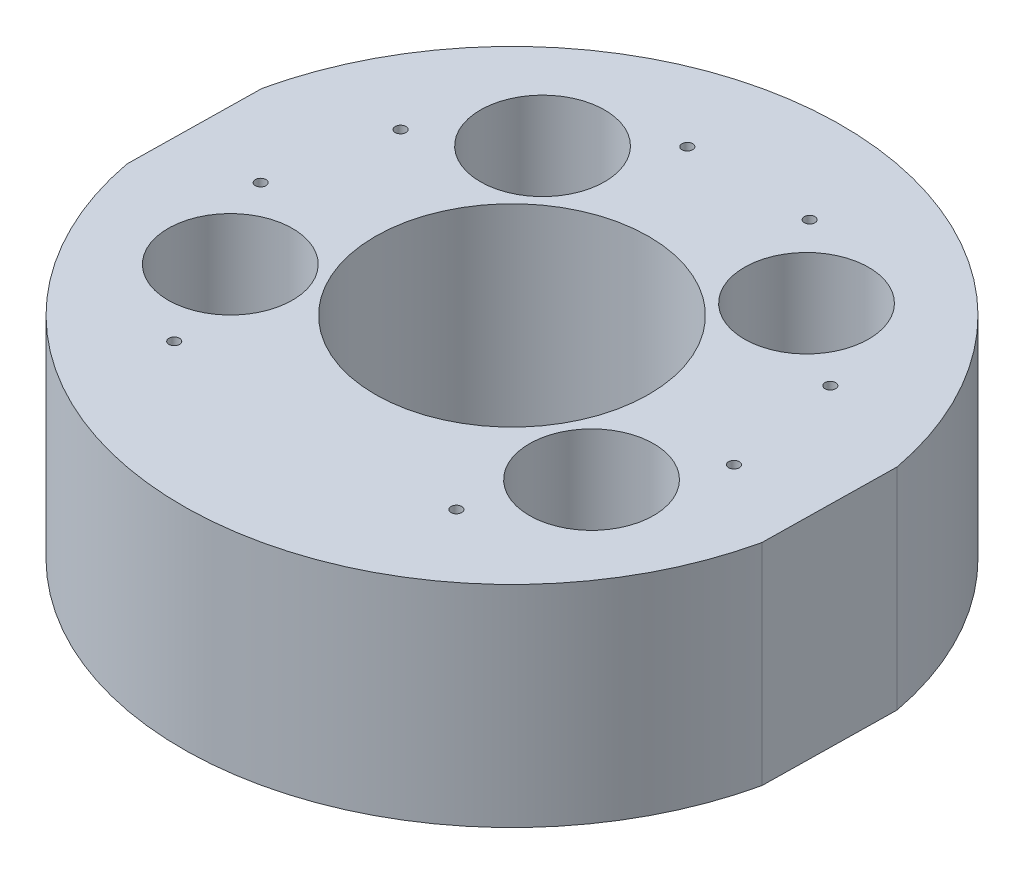
ISO-10303-21;
HEADER;
FILE_DESCRIPTION(('STEP AP214'),'2;1');
FILE_NAME('part.step','',(''),(''),'','','');
FILE_SCHEMA(('AUTOMOTIVE_DESIGN { 1 0 10303 214 1 1 1 1 }'));
ENDSEC;
DATA;
#1=APPLICATION_CONTEXT('core data for automotive mechanical design processes');
#2=APPLICATION_PROTOCOL_DEFINITION('international standard','automotive_design',2000,#1);
#3=PRODUCT_CONTEXT('',#1,'mechanical');
#4=PRODUCT('Part','Part','',(#3));
#5=PRODUCT_RELATED_PRODUCT_CATEGORY('part','',(#4));
#6=PRODUCT_DEFINITION_FORMATION('','',#4);
#7=PRODUCT_DEFINITION_CONTEXT('part definition',#1,'design');
#8=PRODUCT_DEFINITION('design','',#6,#7);
#9=PRODUCT_DEFINITION_SHAPE('','',#8);
#10=(LENGTH_UNIT() NAMED_UNIT(*) SI_UNIT(.MILLI.,.METRE.));
#11=(NAMED_UNIT(*) PLANE_ANGLE_UNIT() SI_UNIT($,.RADIAN.));
#12=(NAMED_UNIT(*) SI_UNIT($,.STERADIAN.) SOLID_ANGLE_UNIT());
#13=UNCERTAINTY_MEASURE_WITH_UNIT(LENGTH_MEASURE(1.E-05),#10,'distance_accuracy_value','');
#14=(GEOMETRIC_REPRESENTATION_CONTEXT(3) GLOBAL_UNCERTAINTY_ASSIGNED_CONTEXT((#13)) GLOBAL_UNIT_ASSIGNED_CONTEXT((#10,
#11,#12)) REPRESENTATION_CONTEXT('',''));
#15=CARTESIAN_POINT('',(0.,0.,0.));
#16=DIRECTION('',(0.,0.,1.));
#17=DIRECTION('',(1.,0.,0.));
#18=AXIS2_PLACEMENT_3D('',#15,#16,#17);
#19=CARTESIAN_POINT('',(-1.02943253800123,39.5,1.15205181792758));
#20=DIRECTION('',(0.,1.,0.));
#21=DIRECTION('',(0.,0.,1.));
#22=AXIS2_PLACEMENT_3D('',#19,#20,#21);
#23=PLANE('',#22);
#24=CARTESIAN_POINT('',(-41.6846327055241,39.5,-18.6012947172572));
#25=DIRECTION('',(0.,1.,0.));
#26=DIRECTION('',(0.,0.,1.));
#27=AXIS2_PLACEMENT_3D('',#24,#25,#26);
#28=CIRCLE('',#27,1.00000000006479);
#29=CARTESIAN_POINT('',(-41.6846327055241,39.5,-17.6012947171924));
#30=VERTEX_POINT('',#29);
#31=EDGE_CURVE('E40',#30,#30,#28,.T.);
#32=ORIENTED_EDGE('',*,*,#31,.F.);
#33=EDGE_LOOP('',(#32));
#34=FACE_BOUND('',#33,.T.);
#35=CARTESIAN_POINT('',(-46.1855870726867,39.5,3.1424557064884));
#36=DIRECTION('',(0.,1.,0.));
#37=DIRECTION('',(0.,0.,1.));
#38=AXIS2_PLACEMENT_3D('',#35,#36,#37);
#39=CIRCLE('',#38,1.00000000000402);
#40=CARTESIAN_POINT('',(-46.1855870726867,39.5,4.14245570649242));
#41=VERTEX_POINT('',#40);
#42=EDGE_CURVE('E136',#41,#41,#39,.T.);
#43=ORIENTED_EDGE('',*,*,#42,.F.);
#44=EDGE_LOOP('',(#43));
#45=FACE_BOUND('',#44,.T.);
#46=CARTESIAN_POINT('',(-28.5029622654473,39.5,37.0441841635424));
#47=DIRECTION('',(0.,1.,0.));
#48=DIRECTION('',(0.,0.,1.));
#49=AXIS2_PLACEMENT_3D('',#46,#47,#48);
#50=CIRCLE('',#49,0.999999999978946);
#51=CARTESIAN_POINT('',(-28.5029622654473,39.5,38.0441841635214));
#52=VERTEX_POINT('',#51);
#53=EDGE_CURVE('E133',#52,#52,#50,.T.);
#54=ORIENTED_EDGE('',*,*,#53,.F.);
#55=EDGE_LOOP('',(#54));
#56=FACE_BOUND('',#55,.T.);
#57=CARTESIAN_POINT('',(25.285237233518,39.5,37.9022648080023));
#58=DIRECTION('',(0.,1.,0.));
#59=DIRECTION('',(0.,0.,1.));
#60=AXIS2_PLACEMENT_3D('',#57,#58,#59);
#61=CIRCLE('',#60,1.00000000003391);
#62=CARTESIAN_POINT('',(25.285237233518,39.5,38.9022648080362));
#63=VERTEX_POINT('',#62);
#64=EDGE_CURVE('E129',#63,#63,#61,.T.);
#65=ORIENTED_EDGE('',*,*,#64,.F.);
#66=EDGE_LOOP('',(#65));
#67=FACE_BOUND('',#66,.T.);
#68=CARTESIAN_POINT('',(44.0402541743087,39.5,4.58182435472986));
#69=DIRECTION('',(0.,1.,0.));
#70=DIRECTION('',(0.,0.,1.));
#71=AXIS2_PLACEMENT_3D('',#68,#69,#70);
#72=CIRCLE('',#71,1.00000000003392);
#73=CARTESIAN_POINT('',(44.0402541743087,39.5,5.58182435476378));
#74=VERTEX_POINT('',#73);
#75=EDGE_CURVE('E125',#74,#74,#72,.T.);
#76=ORIENTED_EDGE('',*,*,#75,.F.);
#77=EDGE_LOOP('',(#76));
#78=FACE_BOUND('',#77,.T.);
#79=CARTESIAN_POINT('',(40.2351677453058,39.5,-17.2944319515756));
#80=DIRECTION('',(0.,1.,0.));
#81=DIRECTION('',(0.,0.,1.));
#82=AXIS2_PLACEMENT_3D('',#79,#80,#81);
#83=CIRCLE('',#82,1.00000000000777);
#84=CARTESIAN_POINT('',(40.2351677453058,39.5,-16.2944319515678));
#85=VERTEX_POINT('',#84);
#86=EDGE_CURVE('E121',#85,#85,#83,.T.);
#87=ORIENTED_EDGE('',*,*,#86,.F.);
#88=EDGE_LOOP('',(#87));
#89=FACE_BOUND('',#88,.T.);
#90=CARTESIAN_POINT('',(11.3307376943618,39.5,-42.3251398097147));
#91=DIRECTION('',(0.,1.,0.));
#92=DIRECTION('',(0.,0.,1.));
#93=AXIS2_PLACEMENT_3D('',#90,#91,#92);
#94=CIRCLE('',#93,1.00000000003986);
#95=CARTESIAN_POINT('',(11.3307376943618,39.5,-41.3251398096748));
#96=VERTEX_POINT('',#95);
#97=EDGE_CURVE('E117',#96,#96,#94,.T.);
#98=ORIENTED_EDGE('',*,*,#97,.F.);
#99=EDGE_LOOP('',(#98));
#100=FACE_BOUND('',#99,.T.);
#101=CARTESIAN_POINT('',(-11.9964868371831,39.5,-42.6972779374856));
#102=DIRECTION('',(0.,1.,0.));
#103=DIRECTION('',(0.,0.,1.));
#104=AXIS2_PLACEMENT_3D('',#101,#102,#103);
#105=CIRCLE('',#104,1.00000000010046);
#106=CARTESIAN_POINT('',(-11.9964868371831,39.5,-41.6972779373851));
#107=VERTEX_POINT('',#106);
#108=EDGE_CURVE('E112',#107,#107,#105,.T.);
#109=ORIENTED_EDGE('',*,*,#108,.F.);
#110=EDGE_LOOP('',(#109));
#111=FACE_BOUND('',#110,.T.);
#112=CARTESIAN_POINT('',(33.1065521303134,39.5,20.3661126777402));
#113=DIRECTION('',(0.,1.,0.));
#114=DIRECTION('',(0.,0.,1.));
#115=AXIS2_PLACEMENT_3D('',#112,#113,#114);
#116=CIRCLE('',#115,11.666);
#117=CARTESIAN_POINT('',(33.1065521303134,39.5,32.0321126777402));
#118=VERTEX_POINT('',#117);
#119=EDGE_CURVE('E167',#118,#118,#116,.T.);
#120=ORIENTED_EDGE('',*,*,#119,.F.);
#121=EDGE_LOOP('',(#120));
#122=FACE_BOUND('',#121,.T.);
#123=CARTESIAN_POINT('',(-25.7151840641316,39.5,-29.2627349738644));
#124=DIRECTION('',(0.,1.,0.));
#125=DIRECTION('',(0.,0.,1.));
#126=AXIS2_PLACEMENT_3D('',#123,#124,#125);
#127=CIRCLE('',#126,11.666);
#128=CARTESIAN_POINT('',(-25.7151840641316,39.5,-17.5967349738644));
#129=VERTEX_POINT('',#128);
#130=EDGE_CURVE('E179',#129,#129,#127,.T.);
#131=ORIENTED_EDGE('',*,*,#130,.F.);
#132=EDGE_LOOP('',(#131));
#133=FACE_BOUND('',#132,.T.);
#134=CARTESIAN_POINT('',(-1.02943253800123,39.5,1.15205181792758));
#135=DIRECTION('',(0.,1.,0.));
#136=DIRECTION('',(0.,0.,1.));
#137=AXIS2_PLACEMENT_3D('',#134,#135,#136);
#138=CIRCLE('',#137,61.8170061942189);
#139=CARTESIAN_POINT('',(59.7022572722056,39.5,-10.3806888629692));
#140=VERTEX_POINT('',#139);
#141=CARTESIAN_POINT('',(-61.3623492511472,39.5,-12.3120268991914));
#142=VERTEX_POINT('',#141);
#143=EDGE_CURVE('E90',#140,#142,#138,.T.);
#144=ORIENTED_EDGE('',*,*,#143,.T.);
#145=DIRECTION('',(-0.0159509238824959,0.,0.999872775920664));
#146=VECTOR('',#145,1.);
#147=CARTESIAN_POINT('',(-61.3623492511472,39.5,-12.3120268991914));
#148=LINE('',#147,#146);
#149=CARTESIAN_POINT('',(-61.7611223482096,39.5,12.6847924988252));
#150=VERTEX_POINT('',#149);
#151=EDGE_CURVE('E85',#142,#150,#148,.T.);
#152=ORIENTED_EDGE('',*,*,#151,.T.);
#153=CARTESIAN_POINT('',(-1.02943253800123,39.5,1.15205181792758));
#154=DIRECTION('',(0.,1.,0.));
#155=DIRECTION('',(0.,0.,1.));
#156=AXIS2_PLACEMENT_3D('',#153,#154,#155);
#157=CIRCLE('',#156,61.817006194219);
#158=CARTESIAN_POINT('',(59.303484175144,39.5,14.6161305350469));
#159=VERTEX_POINT('',#158);
#160=EDGE_CURVE('E88',#150,#159,#157,.T.);
#161=ORIENTED_EDGE('',*,*,#160,.T.);
#162=DIRECTION('',(0.0159509238824956,0.,-0.999872775920664));
#163=VECTOR('',#162,1.);
#164=CARTESIAN_POINT('',(59.7022572722056,39.5,-10.3806888629692));
#165=LINE('',#164,#163);
#166=EDGE_CURVE('E55',#159,#140,#165,.T.);
#167=ORIENTED_EDGE('',*,*,#166,.T.);
#168=EDGE_LOOP('',(#144,#152,#161,#167));
#169=FACE_BOUND('',#168,.T.);
#170=CARTESIAN_POINT('',(-1.02943253800123,39.5,1.15205181792758));
#171=DIRECTION('',(0.,1.,0.));
#172=DIRECTION('',(0.,0.,1.));
#173=AXIS2_PLACEMENT_3D('',#170,#171,#172);
#174=CIRCLE('',#173,25.6670000000009);
#175=CARTESIAN_POINT('',(-1.02943253800123,39.5,26.8190518179285));
#176=VERTEX_POINT('',#175);
#177=EDGE_CURVE('E106',#176,#176,#174,.T.);
#178=ORIENTED_EDGE('',*,*,#177,.F.);
#179=EDGE_LOOP('',(#178));
#180=FACE_BOUND('',#179,.T.);
#181=CARTESIAN_POINT('',(24.6139217532643,39.5,-28.4598370899525));
#182=DIRECTION('',(0.,1.,0.));
#183=DIRECTION('',(0.,0.,1.));
#184=AXIS2_PLACEMENT_3D('',#181,#182,#183);
#185=CIRCLE('',#184,11.666);
#186=CARTESIAN_POINT('',(24.6139217532643,39.5,-16.7938370899525));
#187=VERTEX_POINT('',#186);
#188=EDGE_CURVE('E173',#187,#187,#185,.T.);
#189=ORIENTED_EDGE('',*,*,#188,.F.);
#190=EDGE_LOOP('',(#189));
#191=FACE_BOUND('',#190,.T.);
#192=CARTESIAN_POINT('',(-35.7609326951884,39.5,19.2674728958744));
#193=DIRECTION('',(0.,1.,0.));
#194=DIRECTION('',(0.,0.,1.));
#195=AXIS2_PLACEMENT_3D('',#192,#193,#194);
#196=CIRCLE('',#195,11.666);
#197=CARTESIAN_POINT('',(-35.7609326951884,39.5,30.9334728958744));
#198=VERTEX_POINT('',#197);
#199=EDGE_CURVE('E161',#198,#198,#196,.T.);
#200=ORIENTED_EDGE('',*,*,#199,.F.);
#201=EDGE_LOOP('',(#200));
#202=FACE_BOUND('',#201,.T.);
#203=ADVANCED_FACE('F36',(#34,#45,#56,#67,#78,#89,#100,#111,#122,#133,#169,#180,#191,#202),#23,.T.);
#204=CARTESIAN_POINT('',(-1.02943253800123,0.,1.15205181792758));
#205=DIRECTION('',(0.,1.,0.));
#206=DIRECTION('',(0.,0.,1.));
#207=AXIS2_PLACEMENT_3D('',#204,#205,#206);
#208=PLANE('',#207);
#209=CARTESIAN_POINT('',(33.1065521303134,0.,20.3661126777402));
#210=DIRECTION('',(0.,1.,0.));
#211=DIRECTION('',(0.,0.,1.));
#212=AXIS2_PLACEMENT_3D('',#209,#210,#211);
#213=CIRCLE('',#212,11.666);
#214=CARTESIAN_POINT('',(33.1065521303134,0.,32.0321126777402));
#215=VERTEX_POINT('',#214);
#216=EDGE_CURVE('E164',#215,#215,#213,.T.);
#217=ORIENTED_EDGE('',*,*,#216,.T.);
#218=EDGE_LOOP('',(#217));
#219=FACE_BOUND('',#218,.T.);
#220=CARTESIAN_POINT('',(-25.7151840641316,0.,-29.2627349738644));
#221=DIRECTION('',(0.,1.,0.));
#222=DIRECTION('',(0.,0.,1.));
#223=AXIS2_PLACEMENT_3D('',#220,#221,#222);
#224=CIRCLE('',#223,11.666);
#225=CARTESIAN_POINT('',(-25.7151840641316,0.,-17.5967349738644));
#226=VERTEX_POINT('',#225);
#227=EDGE_CURVE('E176',#226,#226,#224,.T.);
#228=ORIENTED_EDGE('',*,*,#227,.T.);
#229=EDGE_LOOP('',(#228));
#230=FACE_BOUND('',#229,.T.);
#231=CARTESIAN_POINT('',(-1.02943253800123,0.,1.15205181792758));
#232=DIRECTION('',(0.,1.,0.));
#233=DIRECTION('',(0.,0.,1.));
#234=AXIS2_PLACEMENT_3D('',#231,#232,#233);
#235=CIRCLE('',#234,61.8170061942189);
#236=CARTESIAN_POINT('',(59.7022572722056,0.,-10.3806888629692));
#237=VERTEX_POINT('',#236);
#238=CARTESIAN_POINT('',(-61.3623492511472,0.,-12.3120268991914));
#239=VERTEX_POINT('',#238);
#240=EDGE_CURVE('E103',#237,#239,#235,.T.);
#241=ORIENTED_EDGE('',*,*,#240,.F.);
#242=DIRECTION('',(0.0159509238824956,0.,-0.999872775920664));
#243=VECTOR('',#242,1.);
#244=CARTESIAN_POINT('',(59.7022572722056,0.,-10.3806888629692));
#245=LINE('',#244,#243);
#246=CARTESIAN_POINT('',(59.303484175144,0.,14.6161305350469));
#247=VERTEX_POINT('',#246);
#248=EDGE_CURVE('E78',#247,#237,#245,.T.);
#249=ORIENTED_EDGE('',*,*,#248,.F.);
#250=CARTESIAN_POINT('',(-1.02943253800123,0.,1.15205181792758));
#251=DIRECTION('',(0.,1.,0.));
#252=DIRECTION('',(0.,0.,1.));
#253=AXIS2_PLACEMENT_3D('',#250,#251,#252);
#254=CIRCLE('',#253,61.817006194219);
#255=CARTESIAN_POINT('',(-61.7611223482096,0.,12.6847924988252));
#256=VERTEX_POINT('',#255);
#257=EDGE_CURVE('E72',#256,#247,#254,.T.);
#258=ORIENTED_EDGE('',*,*,#257,.F.);
#259=DIRECTION('',(-0.0159509238824959,0.,0.999872775920664));
#260=VECTOR('',#259,1.);
#261=CARTESIAN_POINT('',(-61.3623492511472,0.,-12.3120268991914));
#262=LINE('',#261,#260);
#263=EDGE_CURVE('E94',#239,#256,#262,.T.);
#264=ORIENTED_EDGE('',*,*,#263,.F.);
#265=EDGE_LOOP('',(#241,#249,#258,#264));
#266=FACE_BOUND('',#265,.T.);
#267=CARTESIAN_POINT('',(-1.02943253800123,0.,1.15205181792758));
#268=DIRECTION('',(0.,1.,0.));
#269=DIRECTION('',(0.,0.,1.));
#270=AXIS2_PLACEMENT_3D('',#267,#268,#269);
#271=CIRCLE('',#270,25.6670000000009);
#272=CARTESIAN_POINT('',(-1.02943253800123,0.,26.8190518179285));
#273=VERTEX_POINT('',#272);
#274=EDGE_CURVE('E182',#273,#273,#271,.T.);
#275=ORIENTED_EDGE('',*,*,#274,.T.);
#276=EDGE_LOOP('',(#275));
#277=FACE_BOUND('',#276,.T.);
#278=CARTESIAN_POINT('',(24.6139217532643,0.,-28.4598370899525));
#279=DIRECTION('',(0.,1.,0.));
#280=DIRECTION('',(0.,0.,1.));
#281=AXIS2_PLACEMENT_3D('',#278,#279,#280);
#282=CIRCLE('',#281,11.666);
#283=CARTESIAN_POINT('',(24.6139217532643,0.,-16.7938370899525));
#284=VERTEX_POINT('',#283);
#285=EDGE_CURVE('E170',#284,#284,#282,.T.);
#286=ORIENTED_EDGE('',*,*,#285,.T.);
#287=EDGE_LOOP('',(#286));
#288=FACE_BOUND('',#287,.T.);
#289=CARTESIAN_POINT('',(-35.7609326951884,0.,19.2674728958744));
#290=DIRECTION('',(0.,1.,0.));
#291=DIRECTION('',(0.,0.,1.));
#292=AXIS2_PLACEMENT_3D('',#289,#290,#291);
#293=CIRCLE('',#292,11.666);
#294=CARTESIAN_POINT('',(-35.7609326951884,0.,30.9334728958744));
#295=VERTEX_POINT('',#294);
#296=EDGE_CURVE('E115',#295,#295,#293,.T.);
#297=ORIENTED_EDGE('',*,*,#296,.T.);
#298=EDGE_LOOP('',(#297));
#299=FACE_BOUND('',#298,.T.);
#300=ADVANCED_FACE('F190',(#219,#230,#266,#277,#288,#299),#208,.F.);
#301=CARTESIAN_POINT('',(-1.02943253800123,39.5,1.15205181792758));
#302=DIRECTION('',(0.,-1.,0.));
#303=DIRECTION('',(0.,0.,-1.));
#304=AXIS2_PLACEMENT_3D('',#301,#302,#303);
#305=CYLINDRICAL_SURFACE('',#304,61.8170061942189);
#306=ORIENTED_EDGE('',*,*,#240,.T.);
#307=DIRECTION('',(0.,-1.,0.));
#308=VECTOR('',#307,1.);
#309=CARTESIAN_POINT('',(-61.3623492511472,39.5,-12.3120268991914));
#310=LINE('',#309,#308);
#311=EDGE_CURVE('E11',#142,#239,#310,.T.);
#312=ORIENTED_EDGE('',*,*,#311,.F.);
#313=ORIENTED_EDGE('',*,*,#143,.F.);
#314=DIRECTION('',(0.,-1.,0.));
#315=VECTOR('',#314,1.);
#316=CARTESIAN_POINT('',(59.7022572722056,39.5,-10.3806888629692));
#317=LINE('',#316,#315);
#318=EDGE_CURVE('E99',#140,#237,#317,.T.);
#319=ORIENTED_EDGE('',*,*,#318,.T.);
#320=EDGE_LOOP('',(#306,#312,#313,#319));
#321=FACE_BOUND('',#320,.T.);
#322=ADVANCED_FACE('F38',(#321),#305,.T.);
#323=CARTESIAN_POINT('',(-61.3623492511472,39.5,-12.3120268991914));
#324=DIRECTION('',(0.999872775920664,0.,0.0159509238824959));
#325=DIRECTION('',(0.0159509238824959,0.,-0.999872775920664));
#326=AXIS2_PLACEMENT_3D('',#323,#324,#325);
#327=PLANE('',#326);
#328=ORIENTED_EDGE('',*,*,#263,.T.);
#329=DIRECTION('',(0.,-1.,0.));
#330=VECTOR('',#329,1.);
#331=CARTESIAN_POINT('',(-61.7611223482096,39.5,12.6847924988252));
#332=LINE('',#331,#330);
#333=EDGE_CURVE('E46',#150,#256,#332,.T.);
#334=ORIENTED_EDGE('',*,*,#333,.F.);
#335=ORIENTED_EDGE('',*,*,#151,.F.);
#336=ORIENTED_EDGE('',*,*,#311,.T.);
#337=EDGE_LOOP('',(#328,#334,#335,#336));
#338=FACE_BOUND('',#337,.T.);
#339=ADVANCED_FACE('F93',(#338),#327,.F.);
#340=CARTESIAN_POINT('',(-1.02943253800123,39.5,1.15205181792758));
#341=DIRECTION('',(0.,-1.,0.));
#342=DIRECTION('',(0.,0.,-1.));
#343=AXIS2_PLACEMENT_3D('',#340,#341,#342);
#344=CYLINDRICAL_SURFACE('',#343,61.817006194219);
#345=ORIENTED_EDGE('',*,*,#257,.T.);
#346=DIRECTION('',(0.,-1.,0.));
#347=VECTOR('',#346,1.);
#348=CARTESIAN_POINT('',(59.303484175144,39.5,14.6161305350469));
#349=LINE('',#348,#347);
#350=EDGE_CURVE('E95',#159,#247,#349,.T.);
#351=ORIENTED_EDGE('',*,*,#350,.F.);
#352=ORIENTED_EDGE('',*,*,#160,.F.);
#353=ORIENTED_EDGE('',*,*,#333,.T.);
#354=EDGE_LOOP('',(#345,#351,#352,#353));
#355=FACE_BOUND('',#354,.T.);
#356=ADVANCED_FACE('F97',(#355),#344,.T.);
#357=CARTESIAN_POINT('',(59.7022572722056,39.5,-10.3806888629692));
#358=DIRECTION('',(-0.999872775920664,0.,-0.0159509238824956));
#359=DIRECTION('',(-0.0159509238824956,0.,0.999872775920664));
#360=AXIS2_PLACEMENT_3D('',#357,#358,#359);
#361=PLANE('',#360);
#362=ORIENTED_EDGE('',*,*,#248,.T.);
#363=ORIENTED_EDGE('',*,*,#318,.F.);
#364=ORIENTED_EDGE('',*,*,#166,.F.);
#365=ORIENTED_EDGE('',*,*,#350,.T.);
#366=EDGE_LOOP('',(#362,#363,#364,#365));
#367=FACE_BOUND('',#366,.T.);
#368=ADVANCED_FACE('F196',(#367),#361,.F.);
#369=CARTESIAN_POINT('',(-1.02943253800123,39.5,1.15205181792758));
#370=DIRECTION('',(0.,-1.,0.));
#371=DIRECTION('',(0.,0.,-1.));
#372=AXIS2_PLACEMENT_3D('',#369,#370,#371);
#373=CYLINDRICAL_SURFACE('',#372,25.6670000000009);
#374=ORIENTED_EDGE('',*,*,#177,.T.);
#375=EDGE_LOOP('',(#374));
#376=FACE_BOUND('',#375,.T.);
#377=ORIENTED_EDGE('',*,*,#274,.F.);
#378=EDGE_LOOP('',(#377));
#379=FACE_BOUND('',#378,.T.);
#380=ADVANCED_FACE('F193',(#376,#379),#373,.F.);
#381=CARTESIAN_POINT('',(-25.7151840641316,39.5,-29.2627349738644));
#382=DIRECTION('',(0.,-1.,0.));
#383=DIRECTION('',(0.,0.,-1.));
#384=AXIS2_PLACEMENT_3D('',#381,#382,#383);
#385=CYLINDRICAL_SURFACE('',#384,11.666);
#386=ORIENTED_EDGE('',*,*,#130,.T.);
#387=EDGE_LOOP('',(#386));
#388=FACE_BOUND('',#387,.T.);
#389=ORIENTED_EDGE('',*,*,#227,.F.);
#390=EDGE_LOOP('',(#389));
#391=FACE_BOUND('',#390,.T.);
#392=ADVANCED_FACE('F195',(#388,#391),#385,.F.);
#393=CARTESIAN_POINT('',(24.6139217532643,39.5,-28.4598370899525));
#394=DIRECTION('',(0.,-1.,0.));
#395=DIRECTION('',(0.,0.,-1.));
#396=AXIS2_PLACEMENT_3D('',#393,#394,#395);
#397=CYLINDRICAL_SURFACE('',#396,11.666);
#398=ORIENTED_EDGE('',*,*,#188,.T.);
#399=EDGE_LOOP('',(#398));
#400=FACE_BOUND('',#399,.T.);
#401=ORIENTED_EDGE('',*,*,#285,.F.);
#402=EDGE_LOOP('',(#401));
#403=FACE_BOUND('',#402,.T.);
#404=ADVANCED_FACE('F203',(#400,#403),#397,.F.);
#405=CARTESIAN_POINT('',(33.1065521303134,39.5,20.3661126777402));
#406=DIRECTION('',(0.,-1.,0.));
#407=DIRECTION('',(0.,0.,-1.));
#408=AXIS2_PLACEMENT_3D('',#405,#406,#407);
#409=CYLINDRICAL_SURFACE('',#408,11.666);
#410=ORIENTED_EDGE('',*,*,#119,.T.);
#411=EDGE_LOOP('',(#410));
#412=FACE_BOUND('',#411,.T.);
#413=ORIENTED_EDGE('',*,*,#216,.F.);
#414=EDGE_LOOP('',(#413));
#415=FACE_BOUND('',#414,.T.);
#416=ADVANCED_FACE('F270',(#412,#415),#409,.F.);
#417=CARTESIAN_POINT('',(-35.7609326951884,39.5,19.2674728958744));
#418=DIRECTION('',(0.,-1.,0.));
#419=DIRECTION('',(0.,0.,-1.));
#420=AXIS2_PLACEMENT_3D('',#417,#418,#419);
#421=CYLINDRICAL_SURFACE('',#420,11.666);
#422=ORIENTED_EDGE('',*,*,#199,.T.);
#423=EDGE_LOOP('',(#422));
#424=FACE_BOUND('',#423,.T.);
#425=ORIENTED_EDGE('',*,*,#296,.F.);
#426=EDGE_LOOP('',(#425));
#427=FACE_BOUND('',#426,.T.);
#428=ADVANCED_FACE('F279',(#424,#427),#421,.F.);
#429=CARTESIAN_POINT('',(-11.9964868371831,28.5,-42.6972779374856));
#430=DIRECTION('',(0.,1.,0.));
#431=DIRECTION('',(-1.,0.,0.));
#432=AXIS2_PLACEMENT_3D('',#429,#430,#431);
#433=CYLINDRICAL_SURFACE('',#432,1.00000000010046);
#434=ORIENTED_EDGE('',*,*,#108,.T.);
#435=EDGE_LOOP('',(#434));
#436=FACE_BOUND('',#435,.T.);
#437=CARTESIAN_POINT('',(-11.9964868371831,28.5,-42.6972779374856));
#438=DIRECTION('',(0.,1.,0.));
#439=DIRECTION('',(-1.,0.,0.));
#440=AXIS2_PLACEMENT_3D('',#437,#438,#439);
#441=CIRCLE('',#440,1.00000000010046);
#442=CARTESIAN_POINT('',(-12.9964868372835,28.5,-42.6972779374856));
#443=VERTEX_POINT('',#442);
#444=EDGE_CURVE('E116',#443,#443,#441,.T.);
#445=ORIENTED_EDGE('',*,*,#444,.F.);
#446=EDGE_LOOP('',(#445));
#447=FACE_BOUND('',#446,.T.);
#448=ADVANCED_FACE('F288',(#436,#447),#433,.F.);
#449=CARTESIAN_POINT('',(-11.9964868371831,28.5,-42.6972779374856));
#450=DIRECTION('',(0.,1.,0.));
#451=DIRECTION('',(-1.,0.,0.));
#452=AXIS2_PLACEMENT_3D('',#449,#450,#451);
#453=PLANE('',#452);
#454=ORIENTED_EDGE('',*,*,#444,.T.);
#455=EDGE_LOOP('',(#454));
#456=FACE_BOUND('',#455,.T.);
#457=ADVANCED_FACE('F297',(#456),#453,.T.);
#458=CARTESIAN_POINT('',(11.3307376943618,28.5,-42.3251398097147));
#459=DIRECTION('',(0.,1.,0.));
#460=DIRECTION('',(-1.,0.,0.));
#461=AXIS2_PLACEMENT_3D('',#458,#459,#460);
#462=CYLINDRICAL_SURFACE('',#461,1.00000000003986);
#463=ORIENTED_EDGE('',*,*,#97,.T.);
#464=EDGE_LOOP('',(#463));
#465=FACE_BOUND('',#464,.T.);
#466=CARTESIAN_POINT('',(11.3307376943618,28.5,-42.3251398097147));
#467=DIRECTION('',(0.,1.,0.));
#468=DIRECTION('',(-1.,0.,0.));
#469=AXIS2_PLACEMENT_3D('',#466,#467,#468);
#470=CIRCLE('',#469,1.00000000003986);
#471=CARTESIAN_POINT('',(10.3307376943219,28.5,-42.3251398097147));
#472=VERTEX_POINT('',#471);
#473=EDGE_CURVE('E120',#472,#472,#470,.T.);
#474=ORIENTED_EDGE('',*,*,#473,.F.);
#475=EDGE_LOOP('',(#474));
#476=FACE_BOUND('',#475,.T.);
#477=ADVANCED_FACE('F306',(#465,#476),#462,.F.);
#478=CARTESIAN_POINT('',(11.3307376943618,28.5,-42.3251398097147));
#479=DIRECTION('',(0.,1.,0.));
#480=DIRECTION('',(-1.,0.,0.));
#481=AXIS2_PLACEMENT_3D('',#478,#479,#480);
#482=PLANE('',#481);
#483=ORIENTED_EDGE('',*,*,#473,.T.);
#484=EDGE_LOOP('',(#483));
#485=FACE_BOUND('',#484,.T.);
#486=ADVANCED_FACE('F315',(#485),#482,.T.);
#487=CARTESIAN_POINT('',(40.2351677453058,28.5,-17.2944319515756));
#488=DIRECTION('',(0.,1.,0.));
#489=DIRECTION('',(-1.,0.,0.));
#490=AXIS2_PLACEMENT_3D('',#487,#488,#489);
#491=CYLINDRICAL_SURFACE('',#490,1.00000000000777);
#492=ORIENTED_EDGE('',*,*,#86,.T.);
#493=EDGE_LOOP('',(#492));
#494=FACE_BOUND('',#493,.T.);
#495=CARTESIAN_POINT('',(40.2351677453058,28.5,-17.2944319515756));
#496=DIRECTION('',(0.,1.,0.));
#497=DIRECTION('',(-1.,0.,0.));
#498=AXIS2_PLACEMENT_3D('',#495,#496,#497);
#499=CIRCLE('',#498,1.00000000000777);
#500=CARTESIAN_POINT('',(39.235167745298,28.5,-17.2944319515756));
#501=VERTEX_POINT('',#500);
#502=EDGE_CURVE('E124',#501,#501,#499,.T.);
#503=ORIENTED_EDGE('',*,*,#502,.F.);
#504=EDGE_LOOP('',(#503));
#505=FACE_BOUND('',#504,.T.);
#506=ADVANCED_FACE('F324',(#494,#505),#491,.F.);
#507=CARTESIAN_POINT('',(40.2351677453058,28.5,-17.2944319515756));
#508=DIRECTION('',(0.,1.,0.));
#509=DIRECTION('',(-1.,0.,0.));
#510=AXIS2_PLACEMENT_3D('',#507,#508,#509);
#511=PLANE('',#510);
#512=ORIENTED_EDGE('',*,*,#502,.T.);
#513=EDGE_LOOP('',(#512));
#514=FACE_BOUND('',#513,.T.);
#515=ADVANCED_FACE('F333',(#514),#511,.T.);
#516=CARTESIAN_POINT('',(44.0402541743087,28.5,4.58182435472986));
#517=DIRECTION('',(0.,1.,0.));
#518=DIRECTION('',(-1.,0.,0.));
#519=AXIS2_PLACEMENT_3D('',#516,#517,#518);
#520=CYLINDRICAL_SURFACE('',#519,1.00000000003392);
#521=ORIENTED_EDGE('',*,*,#75,.T.);
#522=EDGE_LOOP('',(#521));
#523=FACE_BOUND('',#522,.T.);
#524=CARTESIAN_POINT('',(44.0402541743087,28.5,4.58182435472986));
#525=DIRECTION('',(0.,1.,0.));
#526=DIRECTION('',(-1.,0.,0.));
#527=AXIS2_PLACEMENT_3D('',#524,#525,#526);
#528=CIRCLE('',#527,1.00000000003392);
#529=CARTESIAN_POINT('',(43.0402541742748,28.5,4.58182435472986));
#530=VERTEX_POINT('',#529);
#531=EDGE_CURVE('E128',#530,#530,#528,.T.);
#532=ORIENTED_EDGE('',*,*,#531,.F.);
#533=EDGE_LOOP('',(#532));
#534=FACE_BOUND('',#533,.T.);
#535=ADVANCED_FACE('F342',(#523,#534),#520,.F.);
#536=CARTESIAN_POINT('',(44.0402541743087,28.5,4.58182435472986));
#537=DIRECTION('',(0.,1.,0.));
#538=DIRECTION('',(-1.,0.,0.));
#539=AXIS2_PLACEMENT_3D('',#536,#537,#538);
#540=PLANE('',#539);
#541=ORIENTED_EDGE('',*,*,#531,.T.);
#542=EDGE_LOOP('',(#541));
#543=FACE_BOUND('',#542,.T.);
#544=ADVANCED_FACE('F351',(#543),#540,.T.);
#545=CARTESIAN_POINT('',(25.285237233518,28.5,37.9022648080023));
#546=DIRECTION('',(0.,1.,0.));
#547=DIRECTION('',(-1.,0.,0.));
#548=AXIS2_PLACEMENT_3D('',#545,#546,#547);
#549=CYLINDRICAL_SURFACE('',#548,1.00000000003391);
#550=ORIENTED_EDGE('',*,*,#64,.T.);
#551=EDGE_LOOP('',(#550));
#552=FACE_BOUND('',#551,.T.);
#553=CARTESIAN_POINT('',(25.285237233518,28.5,37.9022648080023));
#554=DIRECTION('',(0.,1.,0.));
#555=DIRECTION('',(-1.,0.,0.));
#556=AXIS2_PLACEMENT_3D('',#553,#554,#555);
#557=CIRCLE('',#556,1.00000000003391);
#558=CARTESIAN_POINT('',(24.2852372334841,28.5,37.9022648080023));
#559=VERTEX_POINT('',#558);
#560=EDGE_CURVE('E132',#559,#559,#557,.T.);
#561=ORIENTED_EDGE('',*,*,#560,.F.);
#562=EDGE_LOOP('',(#561));
#563=FACE_BOUND('',#562,.T.);
#564=ADVANCED_FACE('F360',(#552,#563),#549,.F.);
#565=CARTESIAN_POINT('',(25.285237233518,28.5,37.9022648080023));
#566=DIRECTION('',(0.,1.,0.));
#567=DIRECTION('',(-1.,0.,0.));
#568=AXIS2_PLACEMENT_3D('',#565,#566,#567);
#569=PLANE('',#568);
#570=ORIENTED_EDGE('',*,*,#560,.T.);
#571=EDGE_LOOP('',(#570));
#572=FACE_BOUND('',#571,.T.);
#573=ADVANCED_FACE('F369',(#572),#569,.T.);
#574=CARTESIAN_POINT('',(-28.5029622654473,28.5,37.0441841635424));
#575=DIRECTION('',(0.,1.,0.));
#576=DIRECTION('',(-1.,0.,0.));
#577=AXIS2_PLACEMENT_3D('',#574,#575,#576);
#578=CYLINDRICAL_SURFACE('',#577,0.999999999978946);
#579=ORIENTED_EDGE('',*,*,#53,.T.);
#580=EDGE_LOOP('',(#579));
#581=FACE_BOUND('',#580,.T.);
#582=CARTESIAN_POINT('',(-28.5029622654473,28.5,37.0441841635424));
#583=DIRECTION('',(0.,1.,0.));
#584=DIRECTION('',(-1.,0.,0.));
#585=AXIS2_PLACEMENT_3D('',#582,#583,#584);
#586=CIRCLE('',#585,0.999999999978946);
#587=CARTESIAN_POINT('',(-29.5029622654263,28.5,37.0441841635424));
#588=VERTEX_POINT('',#587);
#589=EDGE_CURVE('E135',#588,#588,#586,.T.);
#590=ORIENTED_EDGE('',*,*,#589,.F.);
#591=EDGE_LOOP('',(#590));
#592=FACE_BOUND('',#591,.T.);
#593=ADVANCED_FACE('F378',(#581,#592),#578,.F.);
#594=CARTESIAN_POINT('',(-28.5029622654473,28.5,37.0441841635424));
#595=DIRECTION('',(0.,1.,0.));
#596=DIRECTION('',(-1.,0.,0.));
#597=AXIS2_PLACEMENT_3D('',#594,#595,#596);
#598=PLANE('',#597);
#599=ORIENTED_EDGE('',*,*,#589,.T.);
#600=EDGE_LOOP('',(#599));
#601=FACE_BOUND('',#600,.T.);
#602=ADVANCED_FACE('F387',(#601),#598,.T.);
#603=CARTESIAN_POINT('',(-46.1855870726867,28.5,3.1424557064884));
#604=DIRECTION('',(0.,1.,0.));
#605=DIRECTION('',(-1.,0.,0.));
#606=AXIS2_PLACEMENT_3D('',#603,#604,#605);
#607=CYLINDRICAL_SURFACE('',#606,1.00000000000402);
#608=ORIENTED_EDGE('',*,*,#42,.T.);
#609=EDGE_LOOP('',(#608));
#610=FACE_BOUND('',#609,.T.);
#611=CARTESIAN_POINT('',(-46.1855870726867,28.5,3.1424557064884));
#612=DIRECTION('',(0.,1.,0.));
#613=DIRECTION('',(-1.,0.,0.));
#614=AXIS2_PLACEMENT_3D('',#611,#612,#613);
#615=CIRCLE('',#614,1.00000000000402);
#616=CARTESIAN_POINT('',(-47.1855870726907,28.5,3.1424557064884));
#617=VERTEX_POINT('',#616);
#618=EDGE_CURVE('E138',#617,#617,#615,.T.);
#619=ORIENTED_EDGE('',*,*,#618,.F.);
#620=EDGE_LOOP('',(#619));
#621=FACE_BOUND('',#620,.T.);
#622=ADVANCED_FACE('F396',(#610,#621),#607,.F.);
#623=CARTESIAN_POINT('',(-46.1855870726867,28.5,3.1424557064884));
#624=DIRECTION('',(0.,1.,0.));
#625=DIRECTION('',(-1.,0.,0.));
#626=AXIS2_PLACEMENT_3D('',#623,#624,#625);
#627=PLANE('',#626);
#628=ORIENTED_EDGE('',*,*,#618,.T.);
#629=EDGE_LOOP('',(#628));
#630=FACE_BOUND('',#629,.T.);
#631=ADVANCED_FACE('F405',(#630),#627,.T.);
#632=CARTESIAN_POINT('',(-41.6846327055241,28.5,-18.6012947172572));
#633=DIRECTION('',(0.,1.,0.));
#634=DIRECTION('',(-1.,0.,0.));
#635=AXIS2_PLACEMENT_3D('',#632,#633,#634);
#636=CYLINDRICAL_SURFACE('',#635,1.00000000006479);
#637=ORIENTED_EDGE('',*,*,#31,.T.);
#638=EDGE_LOOP('',(#637));
#639=FACE_BOUND('',#638,.T.);
#640=CARTESIAN_POINT('',(-41.6846327055241,28.5,-18.6012947172572));
#641=DIRECTION('',(0.,1.,0.));
#642=DIRECTION('',(-1.,0.,0.));
#643=AXIS2_PLACEMENT_3D('',#640,#641,#642);
#644=CIRCLE('',#643,1.00000000006479);
#645=CARTESIAN_POINT('',(-42.6846327055889,28.5,-18.6012947172572));
#646=VERTEX_POINT('',#645);
#647=EDGE_CURVE('E148',#646,#646,#644,.T.);
#648=ORIENTED_EDGE('',*,*,#647,.F.);
#649=EDGE_LOOP('',(#648));
#650=FACE_BOUND('',#649,.T.);
#651=ADVANCED_FACE('F413',(#639,#650),#636,.F.);
#652=CARTESIAN_POINT('',(-41.6846327055241,28.5,-18.6012947172572));
#653=DIRECTION('',(0.,1.,0.));
#654=DIRECTION('',(-1.,0.,0.));
#655=AXIS2_PLACEMENT_3D('',#652,#653,#654);
#656=PLANE('',#655);
#657=ORIENTED_EDGE('',*,*,#647,.T.);
#658=EDGE_LOOP('',(#657));
#659=FACE_BOUND('',#658,.T.);
#660=ADVANCED_FACE('F421',(#659),#656,.T.);
#661=CLOSED_SHELL('',(#203,#300,#322,#339,#356,#368,#380,#392,#404,#416,#428,#448,#457,#477,
#486,#506,#515,#535,#544,#564,#573,#593,#602,#622,#631,#651,#660));
#662=MANIFOLD_SOLID_BREP('B2',#661);
#663=ADVANCED_BREP_SHAPE_REPRESENTATION('',(#18,#662),#14);
#664=SHAPE_DEFINITION_REPRESENTATION(#9,#663);
ENDSEC;
END-ISO-10303-21;
